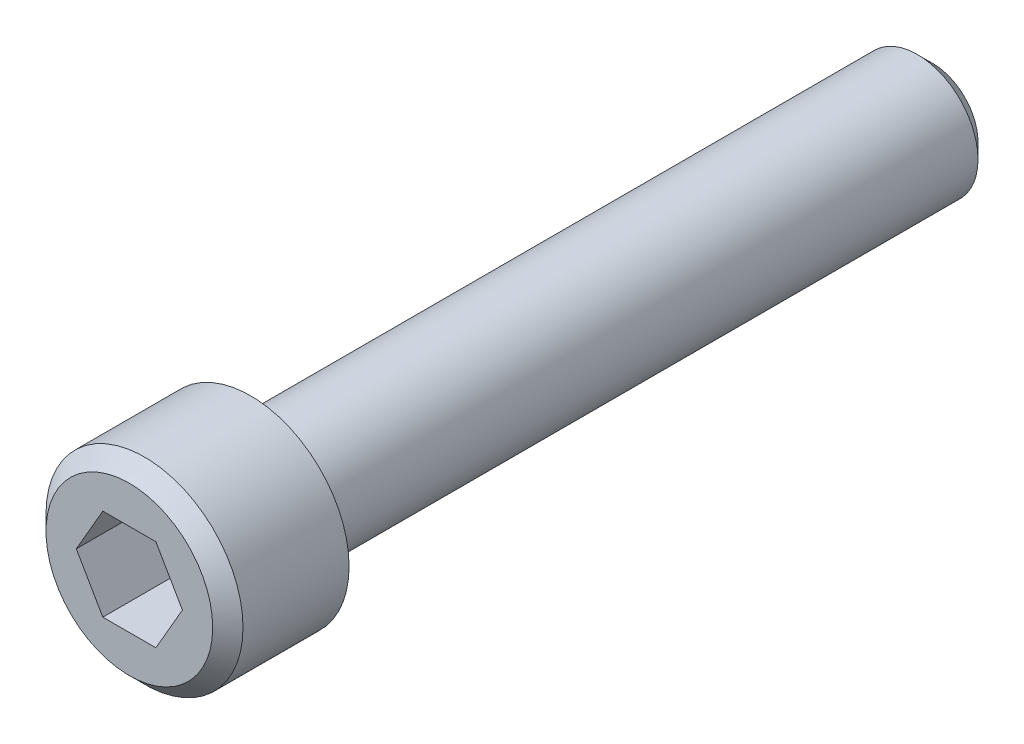
ISO-10303-21;
HEADER;
FILE_DESCRIPTION(('STEP AP214'),'2;1');
FILE_NAME('part.step','',(''),(''),'','','');
FILE_SCHEMA(('AUTOMOTIVE_DESIGN { 1 0 10303 214 1 1 1 1 }'));
ENDSEC;
DATA;
#1=APPLICATION_CONTEXT('core data for automotive mechanical design processes');
#2=APPLICATION_PROTOCOL_DEFINITION('international standard','automotive_design',2000,#1);
#3=PRODUCT_CONTEXT('',#1,'mechanical');
#4=PRODUCT('Part','Part','',(#3));
#5=PRODUCT_RELATED_PRODUCT_CATEGORY('part','',(#4));
#6=PRODUCT_DEFINITION_FORMATION('','',#4);
#7=PRODUCT_DEFINITION_CONTEXT('part definition',#1,'design');
#8=PRODUCT_DEFINITION('design','',#6,#7);
#9=PRODUCT_DEFINITION_SHAPE('','',#8);
#10=(LENGTH_UNIT() NAMED_UNIT(*) SI_UNIT(.MILLI.,.METRE.));
#11=(NAMED_UNIT(*) PLANE_ANGLE_UNIT() SI_UNIT($,.RADIAN.));
#12=(NAMED_UNIT(*) SI_UNIT($,.STERADIAN.) SOLID_ANGLE_UNIT());
#13=UNCERTAINTY_MEASURE_WITH_UNIT(LENGTH_MEASURE(1.E-05),#10,'distance_accuracy_value','');
#14=(GEOMETRIC_REPRESENTATION_CONTEXT(3) GLOBAL_UNCERTAINTY_ASSIGNED_CONTEXT((#13)) GLOBAL_UNIT_ASSIGNED_CONTEXT((#10,
#11,#12)) REPRESENTATION_CONTEXT('',''));
#15=CARTESIAN_POINT('',(0.,0.,0.));
#16=DIRECTION('',(0.,0.,1.));
#17=DIRECTION('',(1.,0.,0.));
#18=AXIS2_PLACEMENT_3D('',#15,#16,#17);
#19=CARTESIAN_POINT('',(0.,0.,0.));
#20=DIRECTION('',(0.,0.,1.));
#21=DIRECTION('',(1.,0.,0.));
#22=AXIS2_PLACEMENT_3D('',#19,#20,#21);
#23=PLANE('',#22);
#24=CARTESIAN_POINT('',(0.,0.,0.));
#25=DIRECTION('',(0.,0.,1.));
#26=DIRECTION('',(1.,0.,0.));
#27=AXIS2_PLACEMENT_3D('',#24,#25,#26);
#28=CIRCLE('',#27,6.5);
#29=CARTESIAN_POINT('',(6.5,0.,0.));
#30=VERTEX_POINT('',#29);
#31=EDGE_CURVE('E135',#30,#30,#28,.T.);
#32=ORIENTED_EDGE('',*,*,#31,.F.);
#33=EDGE_LOOP('',(#32));
#34=FACE_BOUND('',#33,.T.);
#35=CARTESIAN_POINT('',(0.,0.,0.));
#36=DIRECTION('',(0.,0.,1.));
#37=DIRECTION('',(1.,0.,0.));
#38=AXIS2_PLACEMENT_3D('',#35,#36,#37);
#39=CIRCLE('',#38,4.);
#40=CARTESIAN_POINT('',(4.,0.,0.));
#41=VERTEX_POINT('',#40);
#42=EDGE_CURVE('E143',#41,#41,#39,.F.);
#43=ORIENTED_EDGE('',*,*,#42,.F.);
#44=EDGE_LOOP('',(#43));
#45=FACE_BOUND('',#44,.T.);
#46=ADVANCED_FACE('F33',(#34,#45),#23,.F.);
#47=CARTESIAN_POINT('',(0.,0.,8.));
#48=DIRECTION('',(0.,0.,-1.));
#49=DIRECTION('',(-1.,0.,0.));
#50=AXIS2_PLACEMENT_3D('',#47,#48,#49);
#51=CYLINDRICAL_SURFACE('',#50,6.5);
#52=CARTESIAN_POINT('',(0.,0.,7.));
#53=DIRECTION('',(0.,0.,1.));
#54=DIRECTION('',(1.,0.,0.));
#55=AXIS2_PLACEMENT_3D('',#52,#53,#54);
#56=CIRCLE('',#55,6.5);
#57=CARTESIAN_POINT('',(6.5,0.,7.));
#58=VERTEX_POINT('',#57);
#59=EDGE_CURVE('E149',#58,#58,#56,.F.);
#60=ORIENTED_EDGE('',*,*,#59,.T.);
#61=EDGE_LOOP('',(#60));
#62=FACE_BOUND('',#61,.T.);
#63=ORIENTED_EDGE('',*,*,#31,.T.);
#64=EDGE_LOOP('',(#63));
#65=FACE_BOUND('',#64,.T.);
#66=ADVANCED_FACE('F169',(#62,#65),#51,.T.);
#67=CARTESIAN_POINT('',(0.,0.,8.));
#68=DIRECTION('',(0.,0.,1.));
#69=DIRECTION('',(1.,0.,0.));
#70=AXIS2_PLACEMENT_3D('',#67,#68,#69);
#71=PLANE('',#70);
#72=DIRECTION('',(0.5,0.866025403784439,0.));
#73=VECTOR('',#72,1.);
#74=CARTESIAN_POINT('',(1.75,-3.03108891324554,8.));
#75=LINE('',#74,#73);
#76=CARTESIAN_POINT('',(1.75,-3.03108891324554,8.));
#77=VERTEX_POINT('',#76);
#78=CARTESIAN_POINT('',(3.5,0.,8.));
#79=VERTEX_POINT('',#78);
#80=EDGE_CURVE('E48',#77,#79,#75,.T.);
#81=ORIENTED_EDGE('',*,*,#80,.F.);
#82=DIRECTION('',(1.,0.,0.));
#83=VECTOR('',#82,1.);
#84=CARTESIAN_POINT('',(-1.75,-3.03108891324554,8.));
#85=LINE('',#84,#83);
#86=CARTESIAN_POINT('',(-1.75,-3.03108891324554,8.));
#87=VERTEX_POINT('',#86);
#88=EDGE_CURVE('E131',#87,#77,#85,.T.);
#89=ORIENTED_EDGE('',*,*,#88,.F.);
#90=DIRECTION('',(0.5,-0.866025403784439,0.));
#91=VECTOR('',#90,1.);
#92=CARTESIAN_POINT('',(-3.5,0.,8.));
#93=LINE('',#92,#91);
#94=CARTESIAN_POINT('',(-3.5,0.,8.));
#95=VERTEX_POINT('',#94);
#96=EDGE_CURVE('E129',#95,#87,#93,.T.);
#97=ORIENTED_EDGE('',*,*,#96,.F.);
#98=DIRECTION('',(-0.5,-0.866025403784439,0.));
#99=VECTOR('',#98,1.);
#100=CARTESIAN_POINT('',(-1.75,3.03108891324554,8.));
#101=LINE('',#100,#99);
#102=CARTESIAN_POINT('',(-1.75,3.03108891324554,8.));
#103=VERTEX_POINT('',#102);
#104=EDGE_CURVE('E96',#103,#95,#101,.T.);
#105=ORIENTED_EDGE('',*,*,#104,.F.);
#106=DIRECTION('',(-1.,0.,0.));
#107=VECTOR('',#106,1.);
#108=CARTESIAN_POINT('',(1.75,3.03108891324554,8.));
#109=LINE('',#108,#107);
#110=CARTESIAN_POINT('',(1.75,3.03108891324554,8.));
#111=VERTEX_POINT('',#110);
#112=EDGE_CURVE('E125',#111,#103,#109,.T.);
#113=ORIENTED_EDGE('',*,*,#112,.F.);
#114=DIRECTION('',(-0.5,0.866025403784438,0.));
#115=VECTOR('',#114,1.);
#116=CARTESIAN_POINT('',(3.5,0.,8.));
#117=LINE('',#116,#115);
#118=EDGE_CURVE('E122',#79,#111,#117,.T.);
#119=ORIENTED_EDGE('',*,*,#118,.F.);
#120=EDGE_LOOP('',(#81,#89,#97,#105,#113,#119));
#121=FACE_BOUND('',#120,.T.);
#122=CARTESIAN_POINT('',(0.,0.,8.));
#123=DIRECTION('',(0.,0.,1.));
#124=DIRECTION('',(1.,0.,0.));
#125=AXIS2_PLACEMENT_3D('',#122,#123,#124);
#126=CIRCLE('',#125,5.50000000000001);
#127=CARTESIAN_POINT('',(5.50000000000001,0.,8.));
#128=VERTEX_POINT('',#127);
#129=EDGE_CURVE('E146',#128,#128,#126,.T.);
#130=ORIENTED_EDGE('',*,*,#129,.T.);
#131=EDGE_LOOP('',(#130));
#132=FACE_BOUND('',#131,.T.);
#133=ADVANCED_FACE('F175',(#121,#132),#71,.T.);
#134=CARTESIAN_POINT('',(0.,0.,-45.));
#135=DIRECTION('',(0.,0.,1.));
#136=DIRECTION('',(1.,0.,0.));
#137=AXIS2_PLACEMENT_3D('',#134,#135,#136);
#138=CYLINDRICAL_SURFACE('',#137,4.);
#139=CARTESIAN_POINT('',(0.,0.,-44.));
#140=DIRECTION('',(0.,0.,-1.));
#141=DIRECTION('',(-1.,0.,0.));
#142=AXIS2_PLACEMENT_3D('',#139,#140,#141);
#143=CIRCLE('',#142,4.);
#144=CARTESIAN_POINT('',(4.,0.,-44.));
#145=VERTEX_POINT('',#144);
#146=EDGE_CURVE('E11',#145,#145,#143,.F.);
#147=CARTESIAN_POINT('',(4.,0.,-44.));
#148=CARTESIAN_POINT('',(4.,0.,-43.5416666666667));
#149=CARTESIAN_POINT('',(4.,0.,-43.0833333333334));
#150=CARTESIAN_POINT('',(4.,0.,-42.1666666666667));
#151=CARTESIAN_POINT('',(4.,0.,-41.7083333333334));
#152=CARTESIAN_POINT('',(4.,0.,-40.7916666666667));
#153=CARTESIAN_POINT('',(4.,0.,-40.3333333333333));
#154=CARTESIAN_POINT('',(4.,0.,-39.4166666666667));
#155=CARTESIAN_POINT('',(4.,0.,-38.9583333333333));
#156=CARTESIAN_POINT('',(4.,0.,-38.0416666666667));
#157=CARTESIAN_POINT('',(4.,0.,-37.5833333333333));
#158=CARTESIAN_POINT('',(4.,0.,-36.6666666666667));
#159=CARTESIAN_POINT('',(4.,0.,-36.2083333333333));
#160=CARTESIAN_POINT('',(4.,0.,-35.2916666666667));
#161=CARTESIAN_POINT('',(4.,0.,-34.8333333333333));
#162=CARTESIAN_POINT('',(4.,0.,-33.9166666666667));
#163=CARTESIAN_POINT('',(4.,0.,-33.4583333333333));
#164=CARTESIAN_POINT('',(4.,0.,-32.5416666666667));
#165=CARTESIAN_POINT('',(4.,0.,-32.0833333333333));
#166=CARTESIAN_POINT('',(4.,0.,-31.1666666666667));
#167=CARTESIAN_POINT('',(4.,0.,-30.7083333333333));
#168=CARTESIAN_POINT('',(4.,0.,-29.7916666666667));
#169=CARTESIAN_POINT('',(4.,0.,-29.3333333333334));
#170=CARTESIAN_POINT('',(4.,0.,-28.4166666666667));
#171=CARTESIAN_POINT('',(4.,0.,-27.9583333333334));
#172=CARTESIAN_POINT('',(4.,0.,-27.0416666666667));
#173=CARTESIAN_POINT('',(4.,0.,-26.5833333333333));
#174=CARTESIAN_POINT('',(4.,0.,-25.6666666666667));
#175=CARTESIAN_POINT('',(4.,0.,-25.2083333333333));
#176=CARTESIAN_POINT('',(4.,0.,-24.2916666666667));
#177=CARTESIAN_POINT('',(4.,0.,-23.8333333333334));
#178=CARTESIAN_POINT('',(4.,0.,-22.9166666666667));
#179=CARTESIAN_POINT('',(4.,0.,-22.4583333333333));
#180=CARTESIAN_POINT('',(4.,0.,-21.5416666666667));
#181=CARTESIAN_POINT('',(4.,0.,-21.0833333333333));
#182=CARTESIAN_POINT('',(4.,0.,-20.1666666666667));
#183=CARTESIAN_POINT('',(4.,0.,-19.7083333333333));
#184=CARTESIAN_POINT('',(4.,0.,-18.7916666666667));
#185=CARTESIAN_POINT('',(4.,0.,-18.3333333333333));
#186=CARTESIAN_POINT('',(4.,0.,-17.4166666666667));
#187=CARTESIAN_POINT('',(4.,0.,-16.9583333333333));
#188=CARTESIAN_POINT('',(4.,0.,-16.0416666666667));
#189=CARTESIAN_POINT('',(4.,0.,-15.5833333333333));
#190=CARTESIAN_POINT('',(4.,0.,-14.6666666666667));
#191=CARTESIAN_POINT('',(4.,0.,-14.2083333333333));
#192=CARTESIAN_POINT('',(4.,0.,-13.2916666666667));
#193=CARTESIAN_POINT('',(4.,0.,-12.8333333333333));
#194=CARTESIAN_POINT('',(4.,0.,-11.9166666666667));
#195=CARTESIAN_POINT('',(4.,0.,-11.4583333333333));
#196=CARTESIAN_POINT('',(4.,0.,-10.5416666666667));
#197=CARTESIAN_POINT('',(4.,0.,-10.0833333333333));
#198=CARTESIAN_POINT('',(4.,0.,-9.16666666666667));
#199=CARTESIAN_POINT('',(4.,0.,-8.70833333333334));
#200=CARTESIAN_POINT('',(4.,0.,-7.79166666666668));
#201=CARTESIAN_POINT('',(4.,0.,-7.33333333333334));
#202=CARTESIAN_POINT('',(4.,0.,-6.41666666666668));
#203=CARTESIAN_POINT('',(4.,0.,-5.95833333333335));
#204=CARTESIAN_POINT('',(4.,0.,-5.04166666666668));
#205=CARTESIAN_POINT('',(4.,0.,-4.58333333333334));
#206=CARTESIAN_POINT('',(4.,0.,-3.66666666666668));
#207=CARTESIAN_POINT('',(4.,0.,-3.20833333333334));
#208=CARTESIAN_POINT('',(4.,0.,-2.29166666666668));
#209=CARTESIAN_POINT('',(4.,0.,-1.83333333333334));
#210=CARTESIAN_POINT('',(4.,0.,-0.916666666666674));
#211=CARTESIAN_POINT('',(4.,0.,-0.45833333333334));
#212=CARTESIAN_POINT('',(4.,0.,0.));
#213=B_SPLINE_CURVE_WITH_KNOTS('',3,(#147,#148,#149,#150,#151,#152,#153,#154,#155,#156,#157,
#158,#159,#160,#161,#162,#163,#164,#165,#166,#167,#168,#169,#170,#171,#172,#173,#174,#175,#176,
#177,#178,#179,#180,#181,#182,#183,#184,#185,#186,#187,#188,#189,#190,#191,#192,#193,#194,#195,
#196,#197,#198,#199,#200,#201,#202,#203,#204,#205,#206,#207,#208,#209,#210,#211,#212),
.UNSPECIFIED.,.F.,.F.,(4,2,2,2,2,2,2,2,2,2,2,2,2,2,2,2,2,2,2,2,2,2,2,2,2,2,2,2,2,2,2,2,4),(0.,
1.37499999999999,2.75,4.125,5.5,6.875,8.25,9.625,11.,12.375,13.75,15.125,16.5,17.875,19.25,
20.625,22.,23.375,24.75,26.125,27.5,28.875,30.25,31.625,33.,34.375,35.75,37.125,38.5,39.875,
41.25,42.625,44.),.UNSPECIFIED.);
#214=EDGE_CURVE('BSEAM183',#145,#41,#213,.T.);
#215=ORIENTED_EDGE('',*,*,#146,.T.);
#216=ORIENTED_EDGE('',*,*,#42,.T.);
#217=ORIENTED_EDGE('',*,*,#214,.T.);
#218=ORIENTED_EDGE('',*,*,#214,.F.);
#219=EDGE_LOOP('',(#215,#217,#216,#218));
#220=FACE_BOUND('',#219,.T.);
#221=ADVANCED_FACE('F183',(#220),#138,.T.);
#222=CARTESIAN_POINT('',(0.,0.,-45.));
#223=DIRECTION('',(0.,0.,-1.));
#224=DIRECTION('',(-1.,0.,0.));
#225=AXIS2_PLACEMENT_3D('',#222,#223,#224);
#226=PLANE('',#225);
#227=CARTESIAN_POINT('',(0.,0.,-45.));
#228=DIRECTION('',(0.,0.,-1.));
#229=DIRECTION('',(-1.,0.,0.));
#230=AXIS2_PLACEMENT_3D('',#227,#228,#229);
#231=CIRCLE('',#230,3.00000000000003);
#232=CARTESIAN_POINT('',(-3.00000000000003,0.,-45.));
#233=VERTEX_POINT('',#232);
#234=EDGE_CURVE('E41',#233,#233,#231,.T.);
#235=ORIENTED_EDGE('',*,*,#234,.T.);
#236=EDGE_LOOP('',(#235));
#237=FACE_BOUND('',#236,.T.);
#238=ADVANCED_FACE('F154',(#237),#226,.T.);
#239=CARTESIAN_POINT('',(0.,0.,8.));
#240=DIRECTION('',(0.,0.,-1.));
#241=DIRECTION('',(-1.,0.,0.));
#242=AXIS2_PLACEMENT_3D('',#239,#240,#241);
#243=CONICAL_SURFACE('',#242,5.50000000000001,0.785398163397448);
#244=ORIENTED_EDGE('',*,*,#59,.F.);
#245=EDGE_LOOP('',(#244));
#246=FACE_BOUND('',#245,.T.);
#247=ORIENTED_EDGE('',*,*,#129,.F.);
#248=EDGE_LOOP('',(#247));
#249=FACE_BOUND('',#248,.T.);
#250=ADVANCED_FACE('F158',(#246,#249),#243,.T.);
#251=CARTESIAN_POINT('',(0.,0.,-45.));
#252=DIRECTION('',(0.,0.,1.));
#253=DIRECTION('',(1.,0.,0.));
#254=AXIS2_PLACEMENT_3D('',#251,#252,#253);
#255=CONICAL_SURFACE('',#254,3.00000000000003,0.785398163397447);
#256=ORIENTED_EDGE('',*,*,#146,.F.);
#257=EDGE_LOOP('',(#256));
#258=FACE_BOUND('',#257,.T.);
#259=ORIENTED_EDGE('',*,*,#234,.F.);
#260=EDGE_LOOP('',(#259));
#261=FACE_BOUND('',#260,.T.);
#262=ADVANCED_FACE('F35',(#258,#261),#255,.T.);
#263=CARTESIAN_POINT('',(1.75,-3.03108891324554,2.));
#264=DIRECTION('',(0.866025403784439,-0.5,0.));
#265=DIRECTION('',(0.5,0.866025403784439,0.));
#266=AXIS2_PLACEMENT_3D('',#263,#264,#265);
#267=PLANE('',#266);
#268=ORIENTED_EDGE('',*,*,#80,.T.);
#269=DIRECTION('',(0.,0.,1.));
#270=VECTOR('',#269,1.);
#271=CARTESIAN_POINT('',(3.5,0.,2.));
#272=LINE('',#271,#270);
#273=CARTESIAN_POINT('',(3.5,0.,2.));
#274=VERTEX_POINT('',#273);
#275=EDGE_CURVE('E78',#274,#79,#272,.T.);
#276=ORIENTED_EDGE('',*,*,#275,.F.);
#277=DIRECTION('',(0.5,0.866025403784439,0.));
#278=VECTOR('',#277,1.);
#279=CARTESIAN_POINT('',(1.75,-3.03108891324554,2.));
#280=LINE('',#279,#278);
#281=CARTESIAN_POINT('',(1.75,-3.03108891324554,2.));
#282=VERTEX_POINT('',#281);
#283=EDGE_CURVE('E133',#282,#274,#280,.T.);
#284=ORIENTED_EDGE('',*,*,#283,.F.);
#285=DIRECTION('',(0.,0.,1.));
#286=VECTOR('',#285,1.);
#287=CARTESIAN_POINT('',(1.75,-3.03108891324554,2.));
#288=LINE('',#287,#286);
#289=EDGE_CURVE('E56',#282,#77,#288,.T.);
#290=ORIENTED_EDGE('',*,*,#289,.T.);
#291=EDGE_LOOP('',(#268,#276,#284,#290));
#292=FACE_BOUND('',#291,.T.);
#293=ADVANCED_FACE('F157',(#292),#267,.F.);
#294=CARTESIAN_POINT('',(-1.75,-3.03108891324554,2.));
#295=DIRECTION('',(0.,-1.,0.));
#296=DIRECTION('',(0.,0.,-1.));
#297=AXIS2_PLACEMENT_3D('',#294,#295,#296);
#298=PLANE('',#297);
#299=ORIENTED_EDGE('',*,*,#88,.T.);
#300=ORIENTED_EDGE('',*,*,#289,.F.);
#301=DIRECTION('',(1.,0.,0.));
#302=VECTOR('',#301,1.);
#303=CARTESIAN_POINT('',(-1.75,-3.03108891324554,2.));
#304=LINE('',#303,#302);
#305=CARTESIAN_POINT('',(-1.75,-3.03108891324554,2.));
#306=VERTEX_POINT('',#305);
#307=EDGE_CURVE('E108',#306,#282,#304,.T.);
#308=ORIENTED_EDGE('',*,*,#307,.F.);
#309=DIRECTION('',(0.,0.,1.));
#310=VECTOR('',#309,1.);
#311=CARTESIAN_POINT('',(-1.75,-3.03108891324554,2.));
#312=LINE('',#311,#310);
#313=EDGE_CURVE('E100',#306,#87,#312,.T.);
#314=ORIENTED_EDGE('',*,*,#313,.T.);
#315=EDGE_LOOP('',(#299,#300,#308,#314));
#316=FACE_BOUND('',#315,.T.);
#317=ADVANCED_FACE('F164',(#316),#298,.F.);
#318=CARTESIAN_POINT('',(-3.5,0.,2.));
#319=DIRECTION('',(-0.866025403784439,-0.5,0.));
#320=DIRECTION('',(0.5,-0.866025403784439,0.));
#321=AXIS2_PLACEMENT_3D('',#318,#319,#320);
#322=PLANE('',#321);
#323=ORIENTED_EDGE('',*,*,#96,.T.);
#324=ORIENTED_EDGE('',*,*,#313,.F.);
#325=DIRECTION('',(0.5,-0.866025403784439,0.));
#326=VECTOR('',#325,1.);
#327=CARTESIAN_POINT('',(-3.5,0.,2.));
#328=LINE('',#327,#326);
#329=CARTESIAN_POINT('',(-3.5,0.,2.));
#330=VERTEX_POINT('',#329);
#331=EDGE_CURVE('E104',#330,#306,#328,.T.);
#332=ORIENTED_EDGE('',*,*,#331,.F.);
#333=DIRECTION('',(0.,0.,1.));
#334=VECTOR('',#333,1.);
#335=CARTESIAN_POINT('',(-3.5,0.,2.));
#336=LINE('',#335,#334);
#337=EDGE_CURVE('E89',#330,#95,#336,.T.);
#338=ORIENTED_EDGE('',*,*,#337,.T.);
#339=EDGE_LOOP('',(#323,#324,#332,#338));
#340=FACE_BOUND('',#339,.T.);
#341=ADVANCED_FACE('F105',(#340),#322,.F.);
#342=CARTESIAN_POINT('',(-1.75,3.03108891324554,2.));
#343=DIRECTION('',(-0.866025403784439,0.5,0.));
#344=DIRECTION('',(-0.5,-0.866025403784439,0.));
#345=AXIS2_PLACEMENT_3D('',#342,#343,#344);
#346=PLANE('',#345);
#347=ORIENTED_EDGE('',*,*,#104,.T.);
#348=ORIENTED_EDGE('',*,*,#337,.F.);
#349=DIRECTION('',(-0.5,-0.866025403784439,0.));
#350=VECTOR('',#349,1.);
#351=CARTESIAN_POINT('',(-1.75,3.03108891324554,2.));
#352=LINE('',#351,#350);
#353=CARTESIAN_POINT('',(-1.75,3.03108891324554,2.));
#354=VERTEX_POINT('',#353);
#355=EDGE_CURVE('E93',#354,#330,#352,.T.);
#356=ORIENTED_EDGE('',*,*,#355,.F.);
#357=DIRECTION('',(0.,0.,1.));
#358=VECTOR('',#357,1.);
#359=CARTESIAN_POINT('',(-1.75,3.03108891324554,2.));
#360=LINE('',#359,#358);
#361=EDGE_CURVE('E101',#354,#103,#360,.T.);
#362=ORIENTED_EDGE('',*,*,#361,.T.);
#363=EDGE_LOOP('',(#347,#348,#356,#362));
#364=FACE_BOUND('',#363,.T.);
#365=ADVANCED_FACE('F91',(#364),#346,.F.);
#366=CARTESIAN_POINT('',(1.75,3.03108891324554,2.));
#367=DIRECTION('',(0.,1.,0.));
#368=DIRECTION('',(0.,0.,1.));
#369=AXIS2_PLACEMENT_3D('',#366,#367,#368);
#370=PLANE('',#369);
#371=ORIENTED_EDGE('',*,*,#112,.T.);
#372=ORIENTED_EDGE('',*,*,#361,.F.);
#373=DIRECTION('',(-1.,0.,0.));
#374=VECTOR('',#373,1.);
#375=CARTESIAN_POINT('',(1.75,3.03108891324554,2.));
#376=LINE('',#375,#374);
#377=CARTESIAN_POINT('',(1.75,3.03108891324554,2.));
#378=VERTEX_POINT('',#377);
#379=EDGE_CURVE('E114',#378,#354,#376,.T.);
#380=ORIENTED_EDGE('',*,*,#379,.F.);
#381=DIRECTION('',(0.,0.,1.));
#382=VECTOR('',#381,1.);
#383=CARTESIAN_POINT('',(1.75,3.03108891324554,2.));
#384=LINE('',#383,#382);
#385=EDGE_CURVE('E138',#378,#111,#384,.T.);
#386=ORIENTED_EDGE('',*,*,#385,.T.);
#387=EDGE_LOOP('',(#371,#372,#380,#386));
#388=FACE_BOUND('',#387,.T.);
#389=ADVANCED_FACE('F193',(#388),#370,.F.);
#390=CARTESIAN_POINT('',(3.5,0.,2.));
#391=DIRECTION('',(0.866025403784438,0.5,0.));
#392=DIRECTION('',(-0.5,0.866025403784439,0.));
#393=AXIS2_PLACEMENT_3D('',#390,#391,#392);
#394=PLANE('',#393);
#395=ORIENTED_EDGE('',*,*,#118,.T.);
#396=ORIENTED_EDGE('',*,*,#385,.F.);
#397=DIRECTION('',(-0.5,0.866025403784438,0.));
#398=VECTOR('',#397,1.);
#399=CARTESIAN_POINT('',(3.5,0.,2.));
#400=LINE('',#399,#398);
#401=EDGE_CURVE('E116',#274,#378,#400,.T.);
#402=ORIENTED_EDGE('',*,*,#401,.F.);
#403=ORIENTED_EDGE('',*,*,#275,.T.);
#404=EDGE_LOOP('',(#395,#396,#402,#403));
#405=FACE_BOUND('',#404,.T.);
#406=ADVANCED_FACE('F190',(#405),#394,.F.);
#407=CARTESIAN_POINT('',(0.,0.,2.));
#408=DIRECTION('',(0.,0.,1.));
#409=DIRECTION('',(1.,0.,0.));
#410=AXIS2_PLACEMENT_3D('',#407,#408,#409);
#411=PLANE('',#410);
#412=ORIENTED_EDGE('',*,*,#283,.T.);
#413=ORIENTED_EDGE('',*,*,#401,.T.);
#414=ORIENTED_EDGE('',*,*,#379,.T.);
#415=ORIENTED_EDGE('',*,*,#355,.T.);
#416=ORIENTED_EDGE('',*,*,#331,.T.);
#417=ORIENTED_EDGE('',*,*,#307,.T.);
#418=EDGE_LOOP('',(#412,#413,#414,#415,#416,#417));
#419=FACE_BOUND('',#418,.T.);
#420=ADVANCED_FACE('F111',(#419),#411,.T.);
#421=CLOSED_SHELL('',(#46,#66,#133,#221,#238,#250,#262,#293,#317,#341,#365,#389,#406,#420));
#422=MANIFOLD_SOLID_BREP('B2',#421);
#423=ADVANCED_BREP_SHAPE_REPRESENTATION('',(#18,#422),#14);
#424=SHAPE_DEFINITION_REPRESENTATION(#9,#423);
ENDSEC;
END-ISO-10303-21;
